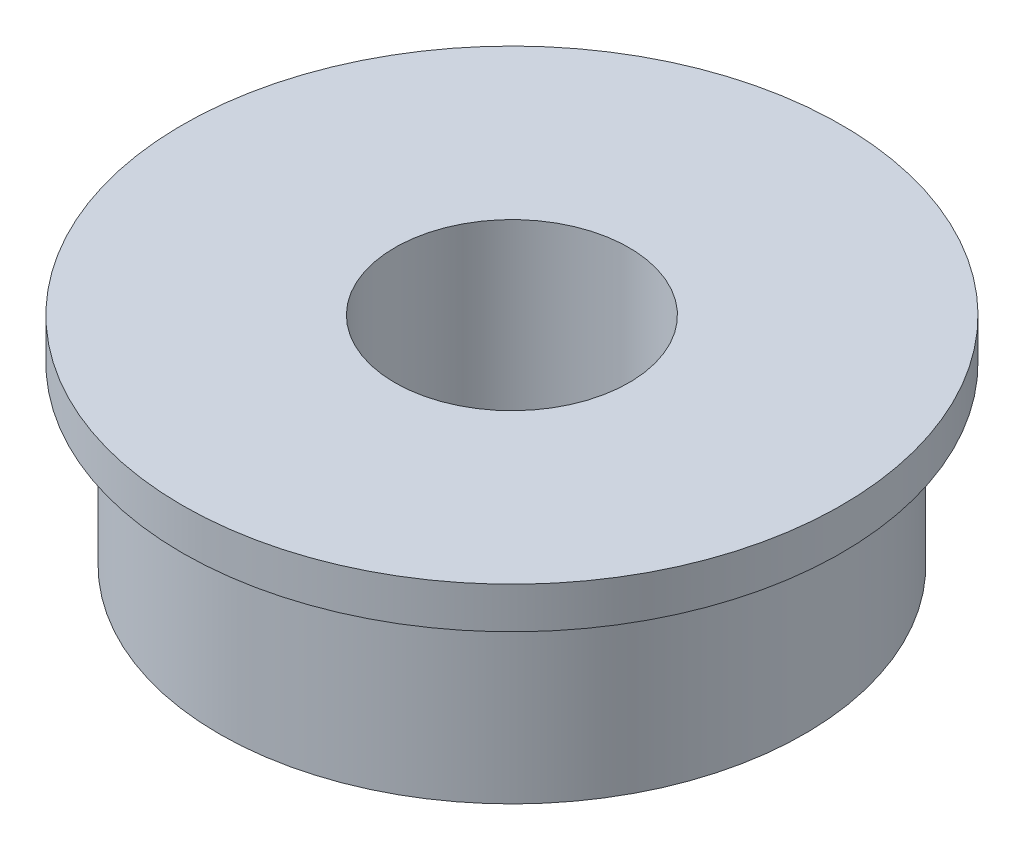
ISO-10303-21;
HEADER;
FILE_DESCRIPTION(('STEP AP214'),'2;1');
FILE_NAME('part.step','',(''),(''),'','','');
FILE_SCHEMA(('AUTOMOTIVE_DESIGN { 1 0 10303 214 1 1 1 1 }'));
ENDSEC;
DATA;
#1=APPLICATION_CONTEXT('core data for automotive mechanical design processes');
#2=APPLICATION_PROTOCOL_DEFINITION('international standard','automotive_design',2000,#1);
#3=PRODUCT_CONTEXT('',#1,'mechanical');
#4=PRODUCT('Part','Part','',(#3));
#5=PRODUCT_RELATED_PRODUCT_CATEGORY('part','',(#4));
#6=PRODUCT_DEFINITION_FORMATION('','',#4);
#7=PRODUCT_DEFINITION_CONTEXT('part definition',#1,'design');
#8=PRODUCT_DEFINITION('design','',#6,#7);
#9=PRODUCT_DEFINITION_SHAPE('','',#8);
#10=(LENGTH_UNIT() NAMED_UNIT(*) SI_UNIT(.MILLI.,.METRE.));
#11=(NAMED_UNIT(*) PLANE_ANGLE_UNIT() SI_UNIT($,.RADIAN.));
#12=(NAMED_UNIT(*) SI_UNIT($,.STERADIAN.) SOLID_ANGLE_UNIT());
#13=UNCERTAINTY_MEASURE_WITH_UNIT(LENGTH_MEASURE(1.E-05),#10,'distance_accuracy_value','');
#14=(GEOMETRIC_REPRESENTATION_CONTEXT(3) GLOBAL_UNCERTAINTY_ASSIGNED_CONTEXT((#13)) GLOBAL_UNIT_ASSIGNED_CONTEXT((#10,
#11,#12)) REPRESENTATION_CONTEXT('',''));
#15=CARTESIAN_POINT('',(0.,0.,0.));
#16=DIRECTION('',(0.,0.,1.));
#17=DIRECTION('',(1.,0.,0.));
#18=AXIS2_PLACEMENT_3D('',#15,#16,#17);
#19=CARTESIAN_POINT('',(0.,0.,0.));
#20=DIRECTION('',(0.,1.,0.));
#21=DIRECTION('',(0.,0.,1.));
#22=AXIS2_PLACEMENT_3D('',#19,#20,#21);
#23=PLANE('',#22);
#24=CARTESIAN_POINT('',(0.,0.,0.));
#25=DIRECTION('',(0.,1.,0.));
#26=DIRECTION('',(0.,0.,1.));
#27=AXIS2_PLACEMENT_3D('',#24,#25,#26);
#28=CIRCLE('',#27,7.9375);
#29=CARTESIAN_POINT('',(0.,0.,7.9375));
#30=VERTEX_POINT('',#29);
#31=EDGE_CURVE('E35',#30,#30,#28,.T.);
#32=ORIENTED_EDGE('',*,*,#31,.F.);
#33=EDGE_LOOP('',(#32));
#34=FACE_BOUND('',#33,.T.);
#35=CARTESIAN_POINT('',(0.,0.,0.));
#36=DIRECTION('',(0.,1.,0.));
#37=DIRECTION('',(0.,0.,1.));
#38=AXIS2_PLACEMENT_3D('',#35,#36,#37);
#39=CIRCLE('',#38,3.175);
#40=CARTESIAN_POINT('',(0.,0.,3.175));
#41=VERTEX_POINT('',#40);
#42=EDGE_CURVE('E42',#41,#41,#39,.T.);
#43=ORIENTED_EDGE('',*,*,#42,.T.);
#44=EDGE_LOOP('',(#43));
#45=FACE_BOUND('',#44,.T.);
#46=ADVANCED_FACE('F31',(#34,#45),#23,.F.);
#47=CARTESIAN_POINT('',(0.,4.7498,0.));
#48=DIRECTION('',(0.,-1.,0.));
#49=DIRECTION('',(0.,0.,-1.));
#50=AXIS2_PLACEMENT_3D('',#47,#48,#49);
#51=CYLINDRICAL_SURFACE('',#50,7.9375);
#52=CARTESIAN_POINT('',(0.,4.7498,0.));
#53=DIRECTION('',(0.,1.,0.));
#54=DIRECTION('',(0.,0.,1.));
#55=AXIS2_PLACEMENT_3D('',#52,#53,#54);
#56=CIRCLE('',#55,7.9375);
#57=CARTESIAN_POINT('',(0.,4.7498,7.9375));
#58=VERTEX_POINT('',#57);
#59=EDGE_CURVE('E10',#58,#58,#56,.T.);
#60=ORIENTED_EDGE('',*,*,#59,.F.);
#61=EDGE_LOOP('',(#60));
#62=FACE_BOUND('',#61,.T.);
#63=ORIENTED_EDGE('',*,*,#31,.T.);
#64=EDGE_LOOP('',(#63));
#65=FACE_BOUND('',#64,.T.);
#66=ADVANCED_FACE('F33',(#62,#65),#51,.T.);
#67=CARTESIAN_POINT('',(0.,4.7498,0.));
#68=DIRECTION('',(0.,-1.,0.));
#69=DIRECTION('',(0.,0.,-1.));
#70=AXIS2_PLACEMENT_3D('',#67,#68,#69);
#71=CYLINDRICAL_SURFACE('',#70,3.175);
#72=ORIENTED_EDGE('',*,*,#42,.F.);
#73=EDGE_LOOP('',(#72));
#74=FACE_BOUND('',#73,.T.);
#75=CARTESIAN_POINT('',(0.,5.8674,0.));
#76=DIRECTION('',(0.,1.,0.));
#77=DIRECTION('',(0.,0.,1.));
#78=AXIS2_PLACEMENT_3D('',#75,#76,#77);
#79=CIRCLE('',#78,3.175);
#80=CARTESIAN_POINT('',(0.,5.8674,3.175));
#81=VERTEX_POINT('',#80);
#82=EDGE_CURVE('E50',#81,#81,#79,.T.);
#83=ORIENTED_EDGE('',*,*,#82,.T.);
#84=EDGE_LOOP('',(#83));
#85=FACE_BOUND('',#84,.T.);
#86=ADVANCED_FACE('F56',(#74,#85),#71,.F.);
#87=CARTESIAN_POINT('',(0.,5.8674,0.));
#88=DIRECTION('',(0.,1.,0.));
#89=DIRECTION('',(0.,0.,1.));
#90=AXIS2_PLACEMENT_3D('',#87,#88,#89);
#91=PLANE('',#90);
#92=CARTESIAN_POINT('',(0.,5.8674,0.));
#93=DIRECTION('',(0.,1.,0.));
#94=DIRECTION('',(0.,0.,1.));
#95=AXIS2_PLACEMENT_3D('',#92,#93,#94);
#96=CIRCLE('',#95,8.9375);
#97=CARTESIAN_POINT('',(0.,5.8674,8.9375));
#98=VERTEX_POINT('',#97);
#99=EDGE_CURVE('E46',#98,#98,#96,.T.);
#100=ORIENTED_EDGE('',*,*,#99,.T.);
#101=EDGE_LOOP('',(#100));
#102=FACE_BOUND('',#101,.T.);
#103=ORIENTED_EDGE('',*,*,#82,.F.);
#104=EDGE_LOOP('',(#103));
#105=FACE_BOUND('',#104,.T.);
#106=ADVANCED_FACE('F58',(#102,#105),#91,.T.);
#107=CARTESIAN_POINT('',(0.,4.7498,0.));
#108=DIRECTION('',(0.,1.,0.));
#109=DIRECTION('',(0.,0.,1.));
#110=AXIS2_PLACEMENT_3D('',#107,#108,#109);
#111=PLANE('',#110);
#112=ORIENTED_EDGE('',*,*,#59,.T.);
#113=EDGE_LOOP('',(#112));
#114=FACE_BOUND('',#113,.T.);
#115=CARTESIAN_POINT('',(0.,4.7498,0.));
#116=DIRECTION('',(0.,1.,0.));
#117=DIRECTION('',(0.,0.,1.));
#118=AXIS2_PLACEMENT_3D('',#115,#116,#117);
#119=CIRCLE('',#118,8.9375);
#120=CARTESIAN_POINT('',(0.,4.7498,8.9375));
#121=VERTEX_POINT('',#120);
#122=EDGE_CURVE('E47',#121,#121,#119,.T.);
#123=ORIENTED_EDGE('',*,*,#122,.F.);
#124=EDGE_LOOP('',(#123));
#125=FACE_BOUND('',#124,.T.);
#126=ADVANCED_FACE('F60',(#114,#125),#111,.F.);
#127=CARTESIAN_POINT('',(0.,5.8674,0.));
#128=DIRECTION('',(0.,-1.,0.));
#129=DIRECTION('',(0.,0.,-1.));
#130=AXIS2_PLACEMENT_3D('',#127,#128,#129);
#131=CYLINDRICAL_SURFACE('',#130,8.9375);
#132=ORIENTED_EDGE('',*,*,#99,.F.);
#133=EDGE_LOOP('',(#132));
#134=FACE_BOUND('',#133,.T.);
#135=ORIENTED_EDGE('',*,*,#122,.T.);
#136=EDGE_LOOP('',(#135));
#137=FACE_BOUND('',#136,.T.);
#138=ADVANCED_FACE('F67',(#134,#137),#131,.T.);
#139=CLOSED_SHELL('',(#46,#66,#86,#106,#126,#138));
#140=MANIFOLD_SOLID_BREP('B2',#139);
#141=ADVANCED_BREP_SHAPE_REPRESENTATION('',(#18,#140),#14);
#142=SHAPE_DEFINITION_REPRESENTATION(#9,#141);
ENDSEC;
END-ISO-10303-21;
